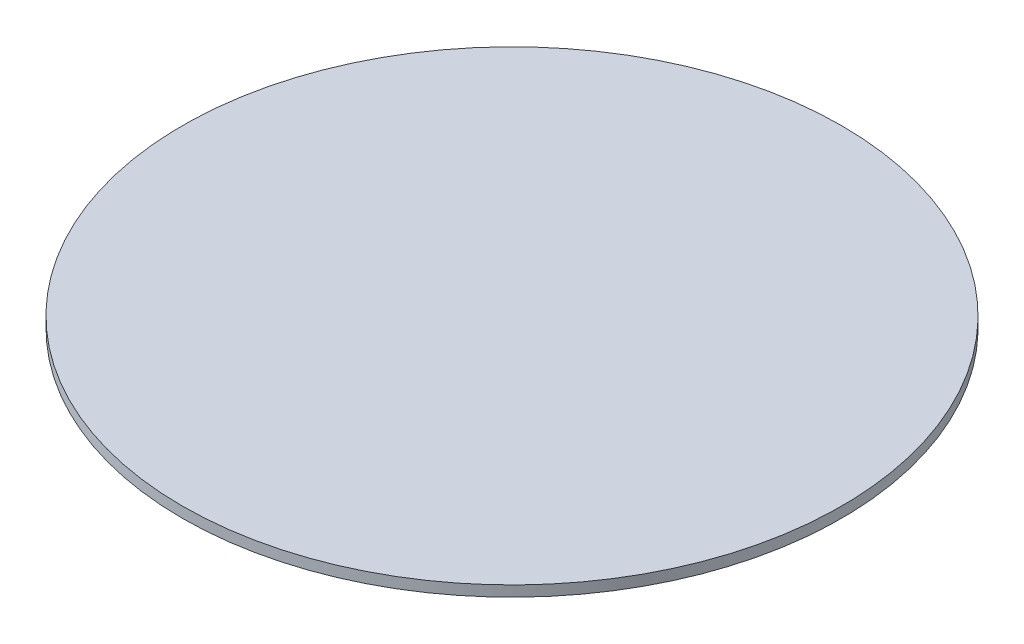
ISO-10303-21;
HEADER;
FILE_DESCRIPTION(('STEP AP214'),'2;1');
FILE_NAME('part.step','',(''),(''),'','','');
FILE_SCHEMA(('AUTOMOTIVE_DESIGN { 1 0 10303 214 1 1 1 1 }'));
ENDSEC;
DATA;
#1=APPLICATION_CONTEXT('core data for automotive mechanical design processes');
#2=APPLICATION_PROTOCOL_DEFINITION('international standard','automotive_design',2000,#1);
#3=PRODUCT_CONTEXT('',#1,'mechanical');
#4=PRODUCT('Part','Part','',(#3));
#5=PRODUCT_RELATED_PRODUCT_CATEGORY('part','',(#4));
#6=PRODUCT_DEFINITION_FORMATION('','',#4);
#7=PRODUCT_DEFINITION_CONTEXT('part definition',#1,'design');
#8=PRODUCT_DEFINITION('design','',#6,#7);
#9=PRODUCT_DEFINITION_SHAPE('','',#8);
#10=(LENGTH_UNIT() NAMED_UNIT(*) SI_UNIT(.MILLI.,.METRE.));
#11=(NAMED_UNIT(*) PLANE_ANGLE_UNIT() SI_UNIT($,.RADIAN.));
#12=(NAMED_UNIT(*) SI_UNIT($,.STERADIAN.) SOLID_ANGLE_UNIT());
#13=UNCERTAINTY_MEASURE_WITH_UNIT(LENGTH_MEASURE(1.E-05),#10,'distance_accuracy_value','');
#14=(GEOMETRIC_REPRESENTATION_CONTEXT(3) GLOBAL_UNCERTAINTY_ASSIGNED_CONTEXT((#13)) GLOBAL_UNIT_ASSIGNED_CONTEXT((#10,
#11,#12)) REPRESENTATION_CONTEXT('',''));
#15=CARTESIAN_POINT('',(0.,0.,0.));
#16=DIRECTION('',(0.,0.,1.));
#17=DIRECTION('',(1.,0.,0.));
#18=AXIS2_PLACEMENT_3D('',#15,#16,#17);
#19=CARTESIAN_POINT('',(0.,0.,0.));
#20=DIRECTION('',(0.,1.,0.));
#21=DIRECTION('',(0.,0.,1.));
#22=AXIS2_PLACEMENT_3D('',#19,#20,#21);
#23=PLANE('',#22);
#24=CARTESIAN_POINT('',(0.,0.,0.));
#25=DIRECTION('',(0.,-1.,0.));
#26=DIRECTION('',(0.,0.,-1.));
#27=AXIS2_PLACEMENT_3D('',#24,#25,#26);
#28=CIRCLE('',#27,7.74999999999994);
#29=CARTESIAN_POINT('',(0.,0.,-7.74999999999994));
#30=VERTEX_POINT('',#29);
#31=EDGE_CURVE('E18',#30,#30,#28,.F.);
#32=ORIENTED_EDGE('',*,*,#31,.F.);
#33=EDGE_LOOP('',(#32));
#34=FACE_BOUND('',#33,.T.);
#35=ADVANCED_FACE('F15',(#34),#23,.F.);
#36=CARTESIAN_POINT('',(0.,0.25,0.));
#37=DIRECTION('',(0.,-1.,0.));
#38=DIRECTION('',(0.,0.,-1.));
#39=AXIS2_PLACEMENT_3D('',#36,#37,#38);
#40=CYLINDRICAL_SURFACE('',#39,7.74999999999994);
#41=ORIENTED_EDGE('',*,*,#31,.T.);
#42=EDGE_LOOP('',(#41));
#43=FACE_BOUND('',#42,.T.);
#44=CARTESIAN_POINT('',(0.,0.25,0.));
#45=DIRECTION('',(0.,-1.,0.));
#46=DIRECTION('',(0.,0.,-1.));
#47=AXIS2_PLACEMENT_3D('',#44,#45,#46);
#48=CIRCLE('',#47,7.74999999999994);
#49=CARTESIAN_POINT('',(0.,0.25,-7.74999999999994));
#50=VERTEX_POINT('',#49);
#51=EDGE_CURVE('E10',#50,#50,#48,.F.);
#52=ORIENTED_EDGE('',*,*,#51,.F.);
#53=EDGE_LOOP('',(#52));
#54=FACE_BOUND('',#53,.T.);
#55=ADVANCED_FACE('F27',(#43,#54),#40,.T.);
#56=CARTESIAN_POINT('',(0.,0.25,0.));
#57=DIRECTION('',(0.,1.,0.));
#58=DIRECTION('',(0.,0.,1.));
#59=AXIS2_PLACEMENT_3D('',#56,#57,#58);
#60=PLANE('',#59);
#61=ORIENTED_EDGE('',*,*,#51,.T.);
#62=EDGE_LOOP('',(#61));
#63=FACE_BOUND('',#62,.T.);
#64=ADVANCED_FACE('F35',(#63),#60,.T.);
#65=CLOSED_SHELL('',(#35,#55,#64));
#66=MANIFOLD_SOLID_BREP('B1',#65);
#67=ADVANCED_BREP_SHAPE_REPRESENTATION('',(#18,#66),#14);
#68=SHAPE_DEFINITION_REPRESENTATION(#9,#67);
ENDSEC;
END-ISO-10303-21;
